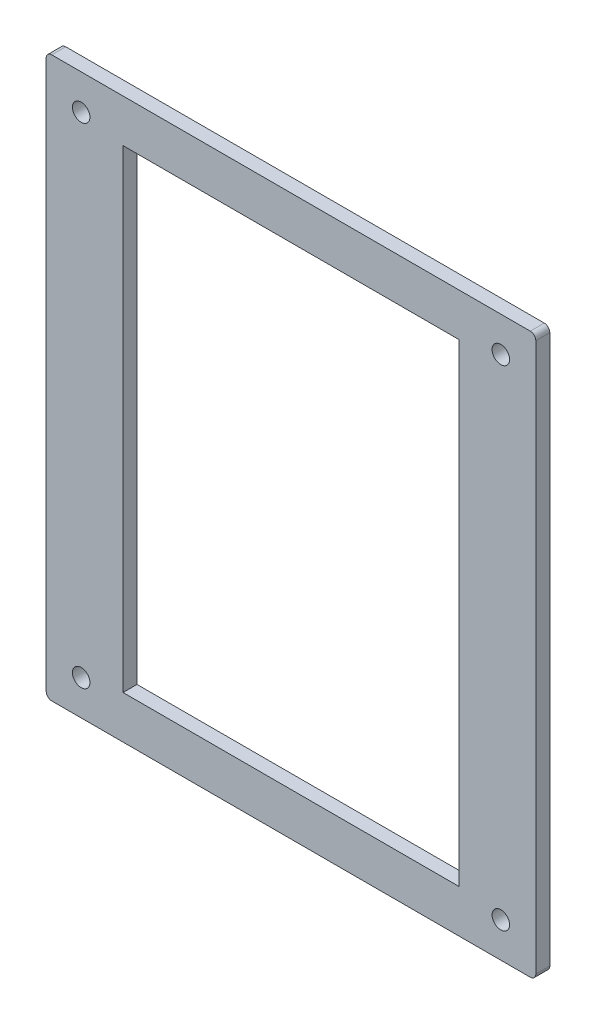
ISO-10303-21;
HEADER;
FILE_DESCRIPTION(('STEP AP214'),'2;1');
FILE_NAME('part.step','',(''),(''),'','','');
FILE_SCHEMA(('AUTOMOTIVE_DESIGN { 1 0 10303 214 1 1 1 1 }'));
ENDSEC;
DATA;
#1=APPLICATION_CONTEXT('core data for automotive mechanical design processes');
#2=APPLICATION_PROTOCOL_DEFINITION('international standard','automotive_design',2000,#1);
#3=PRODUCT_CONTEXT('',#1,'mechanical');
#4=PRODUCT('Part','Part','',(#3));
#5=PRODUCT_RELATED_PRODUCT_CATEGORY('part','',(#4));
#6=PRODUCT_DEFINITION_FORMATION('','',#4);
#7=PRODUCT_DEFINITION_CONTEXT('part definition',#1,'design');
#8=PRODUCT_DEFINITION('design','',#6,#7);
#9=PRODUCT_DEFINITION_SHAPE('','',#8);
#10=(LENGTH_UNIT() NAMED_UNIT(*) SI_UNIT(.MILLI.,.METRE.));
#11=(NAMED_UNIT(*) PLANE_ANGLE_UNIT() SI_UNIT($,.RADIAN.));
#12=(NAMED_UNIT(*) SI_UNIT($,.STERADIAN.) SOLID_ANGLE_UNIT());
#13=UNCERTAINTY_MEASURE_WITH_UNIT(LENGTH_MEASURE(1.E-05),#10,'distance_accuracy_value','');
#14=(GEOMETRIC_REPRESENTATION_CONTEXT(3) GLOBAL_UNCERTAINTY_ASSIGNED_CONTEXT((#13)) GLOBAL_UNIT_ASSIGNED_CONTEXT((#10,
#11,#12)) REPRESENTATION_CONTEXT('',''));
#15=CARTESIAN_POINT('',(0.,0.,0.));
#16=DIRECTION('',(0.,0.,1.));
#17=DIRECTION('',(1.,0.,0.));
#18=AXIS2_PLACEMENT_3D('',#15,#16,#17);
#19=CARTESIAN_POINT('',(0.,0.,2.54));
#20=DIRECTION('',(0.,0.,1.));
#21=DIRECTION('',(1.,0.,0.));
#22=AXIS2_PLACEMENT_3D('',#19,#20,#21);
#23=PLANE('',#22);
#24=CARTESIAN_POINT('',(82.55,-95.25,2.54));
#25=DIRECTION('',(0.,0.,1.));
#26=DIRECTION('',(1.,0.,0.));
#27=AXIS2_PLACEMENT_3D('',#24,#25,#26);
#28=CIRCLE('',#27,1.59);
#29=CARTESIAN_POINT('',(84.14,-95.25,2.54));
#30=VERTEX_POINT('',#29);
#31=EDGE_CURVE('E515',#30,#30,#28,.T.);
#32=ORIENTED_EDGE('',*,*,#31,.F.);
#33=EDGE_LOOP('',(#32));
#34=FACE_BOUND('',#33,.T.);
#35=CARTESIAN_POINT('',(82.55,-6.35,2.54));
#36=DIRECTION('',(0.,0.,1.));
#37=DIRECTION('',(1.,0.,0.));
#38=AXIS2_PLACEMENT_3D('',#35,#36,#37);
#39=CIRCLE('',#38,1.58999999999999);
#40=CARTESIAN_POINT('',(84.14,-6.35,2.54));
#41=VERTEX_POINT('',#40);
#42=EDGE_CURVE('E173',#41,#41,#39,.T.);
#43=ORIENTED_EDGE('',*,*,#42,.F.);
#44=EDGE_LOOP('',(#43));
#45=FACE_BOUND('',#44,.T.);
#46=DIRECTION('',(0.,-1.,0.));
#47=VECTOR('',#46,1.);
#48=CARTESIAN_POINT('',(0.,0.,2.54));
#49=LINE('',#48,#47);
#50=CARTESIAN_POINT('',(0.,-1.,2.54));
#51=VERTEX_POINT('',#50);
#52=CARTESIAN_POINT('',(0.,-100.6,2.54));
#53=VERTEX_POINT('',#52);
#54=EDGE_CURVE('E190',#51,#53,#49,.T.);
#55=ORIENTED_EDGE('',*,*,#54,.T.);
#56=CARTESIAN_POINT('',(1.,-100.6,2.54));
#57=DIRECTION('',(0.,0.,1.));
#58=DIRECTION('',(1.,0.,0.));
#59=AXIS2_PLACEMENT_3D('',#56,#57,#58);
#60=CIRCLE('',#59,1.);
#61=CARTESIAN_POINT('',(1.,-101.6,2.54));
#62=VERTEX_POINT('',#61);
#63=EDGE_CURVE('E252',#53,#62,#60,.T.);
#64=ORIENTED_EDGE('',*,*,#63,.T.);
#65=DIRECTION('',(1.,0.,0.));
#66=VECTOR('',#65,1.);
#67=CARTESIAN_POINT('',(0.,-101.6,2.54));
#68=LINE('',#67,#66);
#69=CARTESIAN_POINT('',(87.9,-101.6,2.54));
#70=VERTEX_POINT('',#69);
#71=EDGE_CURVE('E194',#62,#70,#68,.T.);
#72=ORIENTED_EDGE('',*,*,#71,.T.);
#73=CARTESIAN_POINT('',(87.9,-100.6,2.54));
#74=DIRECTION('',(0.,0.,1.));
#75=DIRECTION('',(1.,0.,0.));
#76=AXIS2_PLACEMENT_3D('',#73,#74,#75);
#77=CIRCLE('',#76,1.);
#78=CARTESIAN_POINT('',(88.9,-100.6,2.54));
#79=VERTEX_POINT('',#78);
#80=EDGE_CURVE('E249',#70,#79,#77,.T.);
#81=ORIENTED_EDGE('',*,*,#80,.T.);
#82=DIRECTION('',(0.,1.,0.));
#83=VECTOR('',#82,1.);
#84=CARTESIAN_POINT('',(88.9,0.,2.54));
#85=LINE('',#84,#83);
#86=CARTESIAN_POINT('',(88.9,-1.,2.54));
#87=VERTEX_POINT('',#86);
#88=EDGE_CURVE('E199',#79,#87,#85,.T.);
#89=ORIENTED_EDGE('',*,*,#88,.T.);
#90=CARTESIAN_POINT('',(87.9,-1.,2.54));
#91=DIRECTION('',(0.,0.,1.));
#92=DIRECTION('',(1.,0.,0.));
#93=AXIS2_PLACEMENT_3D('',#90,#91,#92);
#94=CIRCLE('',#93,1.);
#95=CARTESIAN_POINT('',(87.9,0.,2.54));
#96=VERTEX_POINT('',#95);
#97=EDGE_CURVE('E64',#87,#96,#94,.T.);
#98=ORIENTED_EDGE('',*,*,#97,.T.);
#99=DIRECTION('',(-1.,0.,0.));
#100=VECTOR('',#99,1.);
#101=CARTESIAN_POINT('',(0.,0.,2.54));
#102=LINE('',#101,#100);
#103=CARTESIAN_POINT('',(1.,0.,2.54));
#104=VERTEX_POINT('',#103);
#105=EDGE_CURVE('E202',#96,#104,#102,.T.);
#106=ORIENTED_EDGE('',*,*,#105,.T.);
#107=CARTESIAN_POINT('',(1.,-1.,2.54));
#108=DIRECTION('',(0.,0.,1.));
#109=DIRECTION('',(1.,0.,0.));
#110=AXIS2_PLACEMENT_3D('',#107,#108,#109);
#111=CIRCLE('',#110,1.);
#112=EDGE_CURVE('E244',#104,#51,#111,.T.);
#113=ORIENTED_EDGE('',*,*,#112,.T.);
#114=EDGE_LOOP('',(#55,#64,#72,#81,#89,#98,#106,#113));
#115=FACE_BOUND('',#114,.T.);
#116=DIRECTION('',(1.,0.,0.));
#117=VECTOR('',#116,1.);
#118=CARTESIAN_POINT('',(13.95,-93.8,2.54));
#119=LINE('',#118,#117);
#120=CARTESIAN_POINT('',(13.95,-93.8,2.54));
#121=VERTEX_POINT('',#120);
#122=CARTESIAN_POINT('',(74.95,-93.8,2.54));
#123=VERTEX_POINT('',#122);
#124=EDGE_CURVE('E145',#121,#123,#119,.T.);
#125=ORIENTED_EDGE('',*,*,#124,.F.);
#126=DIRECTION('',(0.,-1.,0.));
#127=VECTOR('',#126,1.);
#128=CARTESIAN_POINT('',(13.95,-7.80000000000003,2.54));
#129=LINE('',#128,#127);
#130=CARTESIAN_POINT('',(13.95,-7.80000000000003,2.54));
#131=VERTEX_POINT('',#130);
#132=EDGE_CURVE('E134',#131,#121,#129,.T.);
#133=ORIENTED_EDGE('',*,*,#132,.F.);
#134=DIRECTION('',(-1.,0.,0.));
#135=VECTOR('',#134,1.);
#136=CARTESIAN_POINT('',(13.95,-7.80000000000003,2.54));
#137=LINE('',#136,#135);
#138=CARTESIAN_POINT('',(74.95,-7.80000000000003,2.54));
#139=VERTEX_POINT('',#138);
#140=EDGE_CURVE('E164',#139,#131,#137,.T.);
#141=ORIENTED_EDGE('',*,*,#140,.F.);
#142=DIRECTION('',(0.,1.,0.));
#143=VECTOR('',#142,1.);
#144=CARTESIAN_POINT('',(74.95,-7.80000000000003,2.54));
#145=LINE('',#144,#143);
#146=EDGE_CURVE('E160',#123,#139,#145,.T.);
#147=ORIENTED_EDGE('',*,*,#146,.F.);
#148=EDGE_LOOP('',(#125,#133,#141,#147));
#149=FACE_BOUND('',#148,.T.);
#150=CARTESIAN_POINT('',(6.34999999999999,-95.25,2.54));
#151=DIRECTION('',(0.,0.,1.));
#152=DIRECTION('',(1.,0.,0.));
#153=AXIS2_PLACEMENT_3D('',#150,#151,#152);
#154=CIRCLE('',#153,1.59);
#155=CARTESIAN_POINT('',(7.94,-95.25,2.54));
#156=VERTEX_POINT('',#155);
#157=EDGE_CURVE('E521',#156,#156,#154,.T.);
#158=ORIENTED_EDGE('',*,*,#157,.F.);
#159=EDGE_LOOP('',(#158));
#160=FACE_BOUND('',#159,.T.);
#161=CARTESIAN_POINT('',(6.35,-6.35,2.54));
#162=DIRECTION('',(0.,0.,1.));
#163=DIRECTION('',(1.,0.,0.));
#164=AXIS2_PLACEMENT_3D('',#161,#162,#163);
#165=CIRCLE('',#164,1.59);
#166=CARTESIAN_POINT('',(7.94,-6.35,2.54));
#167=VERTEX_POINT('',#166);
#168=EDGE_CURVE('E509',#167,#167,#165,.T.);
#169=ORIENTED_EDGE('',*,*,#168,.F.);
#170=EDGE_LOOP('',(#169));
#171=FACE_BOUND('',#170,.T.);
#172=ADVANCED_FACE('F42',(#34,#45,#115,#149,#160,#171),#23,.T.);
#173=CARTESIAN_POINT('',(0.,0.,0.));
#174=DIRECTION('',(0.,0.,1.));
#175=DIRECTION('',(1.,0.,0.));
#176=AXIS2_PLACEMENT_3D('',#173,#174,#175);
#177=PLANE('',#176);
#178=DIRECTION('',(1.,0.,0.));
#179=VECTOR('',#178,1.);
#180=CARTESIAN_POINT('',(0.,-101.6,0.));
#181=LINE('',#180,#179);
#182=CARTESIAN_POINT('',(1.,-101.6,0.));
#183=VERTEX_POINT('',#182);
#184=CARTESIAN_POINT('',(87.9,-101.6,0.));
#185=VERTEX_POINT('',#184);
#186=EDGE_CURVE('E209',#183,#185,#181,.T.);
#187=ORIENTED_EDGE('',*,*,#186,.F.);
#188=CARTESIAN_POINT('',(1.,-100.6,0.));
#189=DIRECTION('',(0.,0.,1.));
#190=DIRECTION('',(1.,0.,0.));
#191=AXIS2_PLACEMENT_3D('',#188,#189,#190);
#192=CIRCLE('',#191,1.);
#193=CARTESIAN_POINT('',(0.,-100.6,0.));
#194=VERTEX_POINT('',#193);
#195=EDGE_CURVE('E234',#183,#194,#192,.F.);
#196=ORIENTED_EDGE('',*,*,#195,.T.);
#197=DIRECTION('',(0.,-1.,0.));
#198=VECTOR('',#197,1.);
#199=CARTESIAN_POINT('',(0.,0.,0.));
#200=LINE('',#199,#198);
#201=CARTESIAN_POINT('',(0.,-1.,0.));
#202=VERTEX_POINT('',#201);
#203=EDGE_CURVE('E154',#202,#194,#200,.T.);
#204=ORIENTED_EDGE('',*,*,#203,.F.);
#205=CARTESIAN_POINT('',(1.,-1.,0.));
#206=DIRECTION('',(0.,0.,1.));
#207=DIRECTION('',(1.,0.,0.));
#208=AXIS2_PLACEMENT_3D('',#205,#206,#207);
#209=CIRCLE('',#208,1.);
#210=CARTESIAN_POINT('',(1.,0.,0.));
#211=VERTEX_POINT('',#210);
#212=EDGE_CURVE('E225',#202,#211,#209,.F.);
#213=ORIENTED_EDGE('',*,*,#212,.T.);
#214=DIRECTION('',(-1.,0.,0.));
#215=VECTOR('',#214,1.);
#216=CARTESIAN_POINT('',(0.,0.,0.));
#217=LINE('',#216,#215);
#218=CARTESIAN_POINT('',(87.9,0.,0.));
#219=VERTEX_POINT('',#218);
#220=EDGE_CURVE('E195',#219,#211,#217,.T.);
#221=ORIENTED_EDGE('',*,*,#220,.F.);
#222=CARTESIAN_POINT('',(87.9,-1.,0.));
#223=DIRECTION('',(0.,0.,1.));
#224=DIRECTION('',(1.,0.,0.));
#225=AXIS2_PLACEMENT_3D('',#222,#223,#224);
#226=CIRCLE('',#225,1.);
#227=CARTESIAN_POINT('',(88.9,-1.,0.));
#228=VERTEX_POINT('',#227);
#229=EDGE_CURVE('E228',#219,#228,#226,.F.);
#230=ORIENTED_EDGE('',*,*,#229,.T.);
#231=DIRECTION('',(0.,1.,0.));
#232=VECTOR('',#231,1.);
#233=CARTESIAN_POINT('',(88.9,0.,0.));
#234=LINE('',#233,#232);
#235=CARTESIAN_POINT('',(88.9,-100.6,0.));
#236=VERTEX_POINT('',#235);
#237=EDGE_CURVE('E213',#236,#228,#234,.T.);
#238=ORIENTED_EDGE('',*,*,#237,.F.);
#239=CARTESIAN_POINT('',(87.9,-100.6,0.));
#240=DIRECTION('',(0.,0.,1.));
#241=DIRECTION('',(1.,0.,0.));
#242=AXIS2_PLACEMENT_3D('',#239,#240,#241);
#243=CIRCLE('',#242,1.);
#244=EDGE_CURVE('E231',#236,#185,#243,.F.);
#245=ORIENTED_EDGE('',*,*,#244,.T.);
#246=EDGE_LOOP('',(#187,#196,#204,#213,#221,#230,#238,#245));
#247=FACE_BOUND('',#246,.T.);
#248=DIRECTION('',(0.,-1.,0.));
#249=VECTOR('',#248,1.);
#250=CARTESIAN_POINT('',(13.95,-7.80000000000003,0.));
#251=LINE('',#250,#249);
#252=CARTESIAN_POINT('',(13.95,-7.80000000000003,0.));
#253=VERTEX_POINT('',#252);
#254=CARTESIAN_POINT('',(13.95,-93.8,0.));
#255=VERTEX_POINT('',#254);
#256=EDGE_CURVE('E170',#253,#255,#251,.T.);
#257=ORIENTED_EDGE('',*,*,#256,.T.);
#258=DIRECTION('',(1.,0.,0.));
#259=VECTOR('',#258,1.);
#260=CARTESIAN_POINT('',(13.95,-93.8,0.));
#261=LINE('',#260,#259);
#262=CARTESIAN_POINT('',(74.95,-93.8,0.));
#263=VERTEX_POINT('',#262);
#264=EDGE_CURVE('E152',#255,#263,#261,.T.);
#265=ORIENTED_EDGE('',*,*,#264,.T.);
#266=DIRECTION('',(0.,1.,0.));
#267=VECTOR('',#266,1.);
#268=CARTESIAN_POINT('',(74.95,-7.80000000000003,0.));
#269=LINE('',#268,#267);
#270=CARTESIAN_POINT('',(74.95,-7.80000000000003,0.));
#271=VERTEX_POINT('',#270);
#272=EDGE_CURVE('E176',#263,#271,#269,.T.);
#273=ORIENTED_EDGE('',*,*,#272,.T.);
#274=DIRECTION('',(-1.,0.,0.));
#275=VECTOR('',#274,1.);
#276=CARTESIAN_POINT('',(13.95,-7.80000000000003,0.));
#277=LINE('',#276,#275);
#278=EDGE_CURVE('E146',#271,#253,#277,.T.);
#279=ORIENTED_EDGE('',*,*,#278,.T.);
#280=EDGE_LOOP('',(#257,#265,#273,#279));
#281=FACE_BOUND('',#280,.T.);
#282=CARTESIAN_POINT('',(82.55,-6.35,0.));
#283=DIRECTION('',(0.,0.,1.));
#284=DIRECTION('',(1.,0.,0.));
#285=AXIS2_PLACEMENT_3D('',#282,#283,#284);
#286=CIRCLE('',#285,1.58999999999999);
#287=CARTESIAN_POINT('',(84.14,-6.35,0.));
#288=VERTEX_POINT('',#287);
#289=EDGE_CURVE('E495',#288,#288,#286,.T.);
#290=ORIENTED_EDGE('',*,*,#289,.T.);
#291=EDGE_LOOP('',(#290));
#292=FACE_BOUND('',#291,.T.);
#293=CARTESIAN_POINT('',(6.34999999999999,-95.25,0.));
#294=DIRECTION('',(0.,0.,1.));
#295=DIRECTION('',(1.,0.,0.));
#296=AXIS2_PLACEMENT_3D('',#293,#294,#295);
#297=CIRCLE('',#296,1.59);
#298=CARTESIAN_POINT('',(7.94,-95.25,0.));
#299=VERTEX_POINT('',#298);
#300=EDGE_CURVE('E499',#299,#299,#297,.T.);
#301=ORIENTED_EDGE('',*,*,#300,.T.);
#302=EDGE_LOOP('',(#301));
#303=FACE_BOUND('',#302,.T.);
#304=CARTESIAN_POINT('',(82.55,-95.25,0.));
#305=DIRECTION('',(0.,0.,1.));
#306=DIRECTION('',(1.,0.,0.));
#307=AXIS2_PLACEMENT_3D('',#304,#305,#306);
#308=CIRCLE('',#307,1.59);
#309=CARTESIAN_POINT('',(84.14,-95.25,0.));
#310=VERTEX_POINT('',#309);
#311=EDGE_CURVE('E503',#310,#310,#308,.T.);
#312=ORIENTED_EDGE('',*,*,#311,.T.);
#313=EDGE_LOOP('',(#312));
#314=FACE_BOUND('',#313,.T.);
#315=CARTESIAN_POINT('',(6.35,-6.35,0.));
#316=DIRECTION('',(0.,0.,1.));
#317=DIRECTION('',(1.,0.,0.));
#318=AXIS2_PLACEMENT_3D('',#315,#316,#317);
#319=CIRCLE('',#318,1.59);
#320=CARTESIAN_POINT('',(7.94,-6.35,0.));
#321=VERTEX_POINT('',#320);
#322=EDGE_CURVE('E506',#321,#321,#319,.T.);
#323=ORIENTED_EDGE('',*,*,#322,.T.);
#324=EDGE_LOOP('',(#323));
#325=FACE_BOUND('',#324,.T.);
#326=ADVANCED_FACE('F272',(#247,#281,#292,#303,#314,#325),#177,.F.);
#327=CARTESIAN_POINT('',(0.,0.,2.54));
#328=DIRECTION('',(1.,0.,0.));
#329=DIRECTION('',(0.,0.,-1.));
#330=AXIS2_PLACEMENT_3D('',#327,#328,#329);
#331=PLANE('',#330);
#332=ORIENTED_EDGE('',*,*,#203,.T.);
#333=DIRECTION('',(0.,0.,-1.));
#334=VECTOR('',#333,1.);
#335=CARTESIAN_POINT('',(0.,-100.6,2.54));
#336=LINE('',#335,#334);
#337=EDGE_CURVE('E241',#194,#53,#336,.F.);
#338=ORIENTED_EDGE('',*,*,#337,.T.);
#339=ORIENTED_EDGE('',*,*,#54,.F.);
#340=DIRECTION('',(0.,0.,-1.));
#341=VECTOR('',#340,1.);
#342=CARTESIAN_POINT('',(0.,-1.,2.54));
#343=LINE('',#342,#341);
#344=EDGE_CURVE('E237',#51,#202,#343,.T.);
#345=ORIENTED_EDGE('',*,*,#344,.T.);
#346=EDGE_LOOP('',(#332,#338,#339,#345));
#347=FACE_BOUND('',#346,.T.);
#348=ADVANCED_FACE('F285',(#347),#331,.F.);
#349=CARTESIAN_POINT('',(0.,-101.6,2.54));
#350=DIRECTION('',(0.,1.,0.));
#351=DIRECTION('',(-1.,0.,0.));
#352=AXIS2_PLACEMENT_3D('',#349,#350,#351);
#353=PLANE('',#352);
#354=ORIENTED_EDGE('',*,*,#71,.F.);
#355=DIRECTION('',(0.,0.,-1.));
#356=VECTOR('',#355,1.);
#357=CARTESIAN_POINT('',(1.,-101.6,2.54));
#358=LINE('',#357,#356);
#359=EDGE_CURVE('E221',#62,#183,#358,.T.);
#360=ORIENTED_EDGE('',*,*,#359,.T.);
#361=ORIENTED_EDGE('',*,*,#186,.T.);
#362=DIRECTION('',(0.,0.,-1.));
#363=VECTOR('',#362,1.);
#364=CARTESIAN_POINT('',(87.9,-101.6,2.54));
#365=LINE('',#364,#363);
#366=EDGE_CURVE('E205',#185,#70,#365,.F.);
#367=ORIENTED_EDGE('',*,*,#366,.T.);
#368=EDGE_LOOP('',(#354,#360,#361,#367));
#369=FACE_BOUND('',#368,.T.);
#370=ADVANCED_FACE('F293',(#369),#353,.F.);
#371=CARTESIAN_POINT('',(88.9,0.,2.54));
#372=DIRECTION('',(-1.,0.,0.));
#373=DIRECTION('',(0.,0.,1.));
#374=AXIS2_PLACEMENT_3D('',#371,#372,#373);
#375=PLANE('',#374);
#376=ORIENTED_EDGE('',*,*,#88,.F.);
#377=DIRECTION('',(0.,0.,-1.));
#378=VECTOR('',#377,1.);
#379=CARTESIAN_POINT('',(88.9,-100.6,2.54));
#380=LINE('',#379,#378);
#381=EDGE_CURVE('E258',#79,#236,#380,.T.);
#382=ORIENTED_EDGE('',*,*,#381,.T.);
#383=ORIENTED_EDGE('',*,*,#237,.T.);
#384=DIRECTION('',(0.,0.,-1.));
#385=VECTOR('',#384,1.);
#386=CARTESIAN_POINT('',(88.9,-1.,2.54));
#387=LINE('',#386,#385);
#388=EDGE_CURVE('E255',#228,#87,#387,.F.);
#389=ORIENTED_EDGE('',*,*,#388,.T.);
#390=EDGE_LOOP('',(#376,#382,#383,#389));
#391=FACE_BOUND('',#390,.T.);
#392=ADVANCED_FACE('F266',(#391),#375,.F.);
#393=CARTESIAN_POINT('',(0.,0.,2.54));
#394=DIRECTION('',(0.,-1.,0.));
#395=DIRECTION('',(0.,0.,-1.));
#396=AXIS2_PLACEMENT_3D('',#393,#394,#395);
#397=PLANE('',#396);
#398=ORIENTED_EDGE('',*,*,#105,.F.);
#399=DIRECTION('',(0.,0.,-1.));
#400=VECTOR('',#399,1.);
#401=CARTESIAN_POINT('',(87.9,0.,2.54));
#402=LINE('',#401,#400);
#403=EDGE_CURVE('E11',#96,#219,#402,.T.);
#404=ORIENTED_EDGE('',*,*,#403,.T.);
#405=ORIENTED_EDGE('',*,*,#220,.T.);
#406=DIRECTION('',(0.,0.,-1.));
#407=VECTOR('',#406,1.);
#408=CARTESIAN_POINT('',(1.,0.,2.54));
#409=LINE('',#408,#407);
#410=EDGE_CURVE('E51',#211,#104,#409,.F.);
#411=ORIENTED_EDGE('',*,*,#410,.T.);
#412=EDGE_LOOP('',(#398,#404,#405,#411));
#413=FACE_BOUND('',#412,.T.);
#414=ADVANCED_FACE('F278',(#413),#397,.F.);
#415=CARTESIAN_POINT('',(13.95,-7.80000000000003,2.54));
#416=DIRECTION('',(1.,0.,0.));
#417=DIRECTION('',(0.,1.,0.));
#418=AXIS2_PLACEMENT_3D('',#415,#416,#417);
#419=PLANE('',#418);
#420=ORIENTED_EDGE('',*,*,#256,.F.);
#421=DIRECTION('',(0.,0.,-1.));
#422=VECTOR('',#421,1.);
#423=CARTESIAN_POINT('',(13.95,-7.80000000000003,2.54));
#424=LINE('',#423,#422);
#425=EDGE_CURVE('E140',#131,#253,#424,.T.);
#426=ORIENTED_EDGE('',*,*,#425,.F.);
#427=ORIENTED_EDGE('',*,*,#132,.T.);
#428=DIRECTION('',(0.,0.,-1.));
#429=VECTOR('',#428,1.);
#430=CARTESIAN_POINT('',(13.95,-93.8,2.54));
#431=LINE('',#430,#429);
#432=EDGE_CURVE('E137',#121,#255,#431,.T.);
#433=ORIENTED_EDGE('',*,*,#432,.T.);
#434=EDGE_LOOP('',(#420,#426,#427,#433));
#435=FACE_BOUND('',#434,.T.);
#436=ADVANCED_FACE('F136',(#435),#419,.T.);
#437=CARTESIAN_POINT('',(13.95,-93.8,2.54));
#438=DIRECTION('',(0.,1.,0.));
#439=DIRECTION('',(-1.,0.,0.));
#440=AXIS2_PLACEMENT_3D('',#437,#438,#439);
#441=PLANE('',#440);
#442=ORIENTED_EDGE('',*,*,#264,.F.);
#443=ORIENTED_EDGE('',*,*,#432,.F.);
#444=ORIENTED_EDGE('',*,*,#124,.T.);
#445=DIRECTION('',(0.,0.,-1.));
#446=VECTOR('',#445,1.);
#447=CARTESIAN_POINT('',(74.95,-93.8,2.54));
#448=LINE('',#447,#446);
#449=EDGE_CURVE('E155',#123,#263,#448,.T.);
#450=ORIENTED_EDGE('',*,*,#449,.T.);
#451=EDGE_LOOP('',(#442,#443,#444,#450));
#452=FACE_BOUND('',#451,.T.);
#453=ADVANCED_FACE('F149',(#452),#441,.T.);
#454=CARTESIAN_POINT('',(74.95,-7.80000000000003,2.54));
#455=DIRECTION('',(-1.,0.,0.));
#456=DIRECTION('',(0.,-1.,0.));
#457=AXIS2_PLACEMENT_3D('',#454,#455,#456);
#458=PLANE('',#457);
#459=ORIENTED_EDGE('',*,*,#272,.F.);
#460=ORIENTED_EDGE('',*,*,#449,.F.);
#461=ORIENTED_EDGE('',*,*,#146,.T.);
#462=DIRECTION('',(0.,0.,-1.));
#463=VECTOR('',#462,1.);
#464=CARTESIAN_POINT('',(74.95,-7.80000000000003,2.54));
#465=LINE('',#464,#463);
#466=EDGE_CURVE('E185',#139,#271,#465,.T.);
#467=ORIENTED_EDGE('',*,*,#466,.T.);
#468=EDGE_LOOP('',(#459,#460,#461,#467));
#469=FACE_BOUND('',#468,.T.);
#470=ADVANCED_FACE('F418',(#469),#458,.T.);
#471=CARTESIAN_POINT('',(13.95,-7.80000000000003,2.54));
#472=DIRECTION('',(0.,-1.,0.));
#473=DIRECTION('',(1.,0.,0.));
#474=AXIS2_PLACEMENT_3D('',#471,#472,#473);
#475=PLANE('',#474);
#476=ORIENTED_EDGE('',*,*,#278,.F.);
#477=ORIENTED_EDGE('',*,*,#466,.F.);
#478=ORIENTED_EDGE('',*,*,#140,.T.);
#479=ORIENTED_EDGE('',*,*,#425,.T.);
#480=EDGE_LOOP('',(#476,#477,#478,#479));
#481=FACE_BOUND('',#480,.T.);
#482=ADVANCED_FACE('F408',(#481),#475,.T.);
#483=CARTESIAN_POINT('',(82.55,-6.35,2.54));
#484=DIRECTION('',(0.,0.,-1.));
#485=DIRECTION('',(-1.,0.,0.));
#486=AXIS2_PLACEMENT_3D('',#483,#484,#485);
#487=CYLINDRICAL_SURFACE('',#486,1.58999999999999);
#488=ORIENTED_EDGE('',*,*,#42,.T.);
#489=EDGE_LOOP('',(#488));
#490=FACE_BOUND('',#489,.T.);
#491=ORIENTED_EDGE('',*,*,#289,.F.);
#492=EDGE_LOOP('',(#491));
#493=FACE_BOUND('',#492,.T.);
#494=ADVANCED_FACE('F398',(#490,#493),#487,.F.);
#495=CARTESIAN_POINT('',(6.34999999999999,-95.25,2.54));
#496=DIRECTION('',(0.,0.,-1.));
#497=DIRECTION('',(-1.,0.,0.));
#498=AXIS2_PLACEMENT_3D('',#495,#496,#497);
#499=CYLINDRICAL_SURFACE('',#498,1.59);
#500=ORIENTED_EDGE('',*,*,#157,.T.);
#501=EDGE_LOOP('',(#500));
#502=FACE_BOUND('',#501,.T.);
#503=ORIENTED_EDGE('',*,*,#300,.F.);
#504=EDGE_LOOP('',(#503));
#505=FACE_BOUND('',#504,.T.);
#506=ADVANCED_FACE('F388',(#502,#505),#499,.F.);
#507=CARTESIAN_POINT('',(82.55,-95.25,2.54));
#508=DIRECTION('',(0.,0.,-1.));
#509=DIRECTION('',(-1.,0.,0.));
#510=AXIS2_PLACEMENT_3D('',#507,#508,#509);
#511=CYLINDRICAL_SURFACE('',#510,1.59);
#512=ORIENTED_EDGE('',*,*,#31,.T.);
#513=EDGE_LOOP('',(#512));
#514=FACE_BOUND('',#513,.T.);
#515=ORIENTED_EDGE('',*,*,#311,.F.);
#516=EDGE_LOOP('',(#515));
#517=FACE_BOUND('',#516,.T.);
#518=ADVANCED_FACE('F379',(#514,#517),#511,.F.);
#519=CARTESIAN_POINT('',(6.35,-6.35,2.54));
#520=DIRECTION('',(0.,0.,-1.));
#521=DIRECTION('',(-1.,0.,0.));
#522=AXIS2_PLACEMENT_3D('',#519,#520,#521);
#523=CYLINDRICAL_SURFACE('',#522,1.59);
#524=ORIENTED_EDGE('',*,*,#168,.T.);
#525=EDGE_LOOP('',(#524));
#526=FACE_BOUND('',#525,.T.);
#527=ORIENTED_EDGE('',*,*,#322,.F.);
#528=EDGE_LOOP('',(#527));
#529=FACE_BOUND('',#528,.T.);
#530=ADVANCED_FACE('F302',(#526,#529),#523,.F.);
#531=CARTESIAN_POINT('',(1.,-100.6,2.54));
#532=DIRECTION('',(0.,0.,-1.));
#533=DIRECTION('',(-1.,0.,0.));
#534=AXIS2_PLACEMENT_3D('',#531,#532,#533);
#535=CYLINDRICAL_SURFACE('',#534,1.);
#536=ORIENTED_EDGE('',*,*,#63,.F.);
#537=ORIENTED_EDGE('',*,*,#337,.F.);
#538=ORIENTED_EDGE('',*,*,#195,.F.);
#539=ORIENTED_EDGE('',*,*,#359,.F.);
#540=EDGE_LOOP('',(#536,#537,#538,#539));
#541=FACE_BOUND('',#540,.T.);
#542=ADVANCED_FACE('F290',(#541),#535,.T.);
#543=CARTESIAN_POINT('',(87.9,-100.6,2.54));
#544=DIRECTION('',(0.,0.,-1.));
#545=DIRECTION('',(-1.,0.,0.));
#546=AXIS2_PLACEMENT_3D('',#543,#544,#545);
#547=CYLINDRICAL_SURFACE('',#546,1.);
#548=ORIENTED_EDGE('',*,*,#80,.F.);
#549=ORIENTED_EDGE('',*,*,#366,.F.);
#550=ORIENTED_EDGE('',*,*,#244,.F.);
#551=ORIENTED_EDGE('',*,*,#381,.F.);
#552=EDGE_LOOP('',(#548,#549,#550,#551));
#553=FACE_BOUND('',#552,.T.);
#554=ADVANCED_FACE('F295',(#553),#547,.T.);
#555=CARTESIAN_POINT('',(87.9,-1.,2.54));
#556=DIRECTION('',(0.,0.,-1.));
#557=DIRECTION('',(-1.,0.,0.));
#558=AXIS2_PLACEMENT_3D('',#555,#556,#557);
#559=CYLINDRICAL_SURFACE('',#558,1.);
#560=ORIENTED_EDGE('',*,*,#97,.F.);
#561=ORIENTED_EDGE('',*,*,#388,.F.);
#562=ORIENTED_EDGE('',*,*,#229,.F.);
#563=ORIENTED_EDGE('',*,*,#403,.F.);
#564=EDGE_LOOP('',(#560,#561,#562,#563));
#565=FACE_BOUND('',#564,.T.);
#566=ADVANCED_FACE('F277',(#565),#559,.T.);
#567=CARTESIAN_POINT('',(1.,-1.,2.54));
#568=DIRECTION('',(0.,0.,-1.));
#569=DIRECTION('',(-1.,0.,0.));
#570=AXIS2_PLACEMENT_3D('',#567,#568,#569);
#571=CYLINDRICAL_SURFACE('',#570,1.);
#572=ORIENTED_EDGE('',*,*,#112,.F.);
#573=ORIENTED_EDGE('',*,*,#410,.F.);
#574=ORIENTED_EDGE('',*,*,#212,.F.);
#575=ORIENTED_EDGE('',*,*,#344,.F.);
#576=EDGE_LOOP('',(#572,#573,#574,#575));
#577=FACE_BOUND('',#576,.T.);
#578=ADVANCED_FACE('F44',(#577),#571,.T.);
#579=CLOSED_SHELL('',(#172,#326,#348,#370,#392,#414,#436,#453,#470,#482,#494,#506,#518,#530,
#542,#554,#566,#578));
#580=MANIFOLD_SOLID_BREP('B2',#579);
#581=ADVANCED_BREP_SHAPE_REPRESENTATION('',(#18,#580),#14);
#582=SHAPE_DEFINITION_REPRESENTATION(#9,#581);
ENDSEC;
END-ISO-10303-21;
